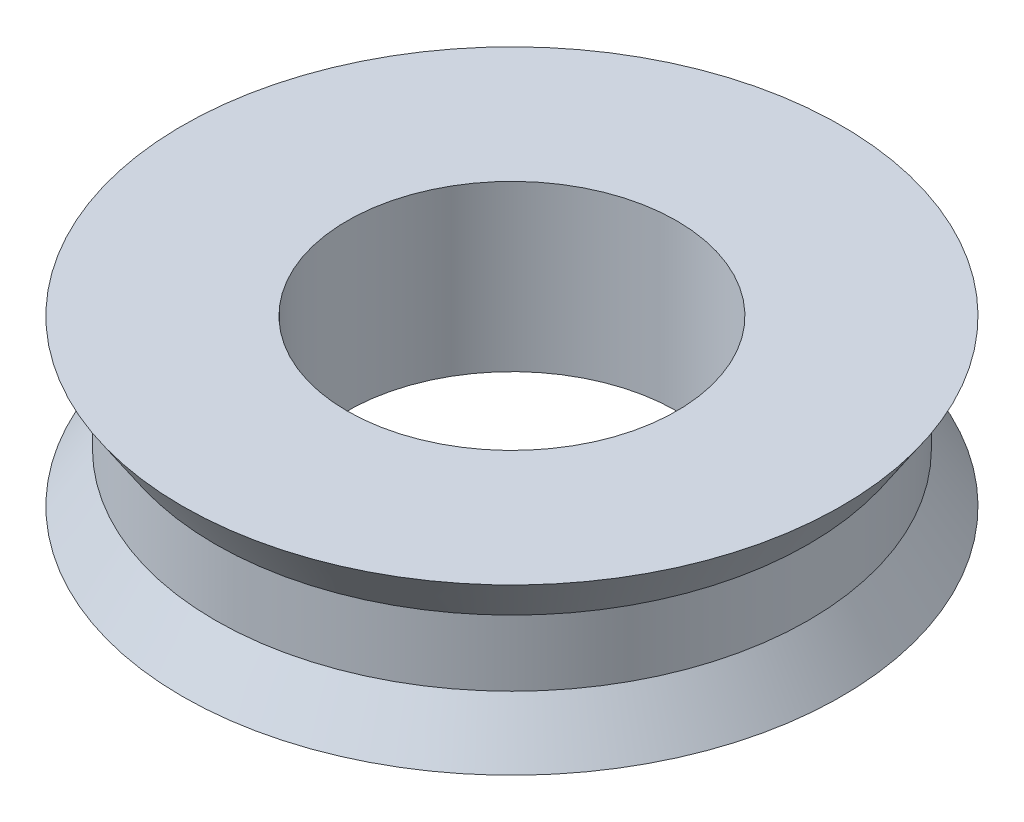
ISO-10303-21;
HEADER;
FILE_DESCRIPTION(('STEP AP214'),'2;1');
FILE_NAME('part.step','',(''),(''),'','','');
FILE_SCHEMA(('AUTOMOTIVE_DESIGN { 1 0 10303 214 1 1 1 1 }'));
ENDSEC;
DATA;
#1=APPLICATION_CONTEXT('core data for automotive mechanical design processes');
#2=APPLICATION_PROTOCOL_DEFINITION('international standard','automotive_design',2000,#1);
#3=PRODUCT_CONTEXT('',#1,'mechanical');
#4=PRODUCT('Part','Part','',(#3));
#5=PRODUCT_RELATED_PRODUCT_CATEGORY('part','',(#4));
#6=PRODUCT_DEFINITION_FORMATION('','',#4);
#7=PRODUCT_DEFINITION_CONTEXT('part definition',#1,'design');
#8=PRODUCT_DEFINITION('design','',#6,#7);
#9=PRODUCT_DEFINITION_SHAPE('','',#8);
#10=(LENGTH_UNIT() NAMED_UNIT(*) SI_UNIT(.MILLI.,.METRE.));
#11=(NAMED_UNIT(*) PLANE_ANGLE_UNIT() SI_UNIT($,.RADIAN.));
#12=(NAMED_UNIT(*) SI_UNIT($,.STERADIAN.) SOLID_ANGLE_UNIT());
#13=UNCERTAINTY_MEASURE_WITH_UNIT(LENGTH_MEASURE(1.E-05),#10,'distance_accuracy_value','');
#14=(GEOMETRIC_REPRESENTATION_CONTEXT(3) GLOBAL_UNCERTAINTY_ASSIGNED_CONTEXT((#13)) GLOBAL_UNIT_ASSIGNED_CONTEXT((#10,
#11,#12)) REPRESENTATION_CONTEXT('',''));
#15=CARTESIAN_POINT('',(0.,0.,0.));
#16=DIRECTION('',(0.,0.,1.));
#17=DIRECTION('',(1.,0.,0.));
#18=AXIS2_PLACEMENT_3D('',#15,#16,#17);
#19=CARTESIAN_POINT('',(0.,4.445,0.));
#20=DIRECTION('',(0.,1.,0.));
#21=DIRECTION('',(0.,0.,1.));
#22=AXIS2_PLACEMENT_3D('',#19,#20,#21);
#23=CONICAL_SURFACE('',#22,11.43,0.588002603547568);
#24=CARTESIAN_POINT('',(0.,6.35,0.));
#25=DIRECTION('',(0.,1.,0.));
#26=DIRECTION('',(0.,0.,1.));
#27=AXIS2_PLACEMENT_3D('',#24,#25,#26);
#28=CIRCLE('',#27,12.7);
#29=CARTESIAN_POINT('',(0.,6.35,12.7));
#30=VERTEX_POINT('',#29);
#31=EDGE_CURVE('E55',#30,#30,#28,.T.);
#32=ORIENTED_EDGE('',*,*,#31,.F.);
#33=EDGE_LOOP('',(#32));
#34=FACE_BOUND('',#33,.T.);
#35=CARTESIAN_POINT('',(0.,4.445,0.));
#36=DIRECTION('',(0.,1.,0.));
#37=DIRECTION('',(0.,0.,1.));
#38=AXIS2_PLACEMENT_3D('',#35,#36,#37);
#39=CIRCLE('',#38,11.43);
#40=CARTESIAN_POINT('',(0.,4.445,11.43));
#41=VERTEX_POINT('',#40);
#42=EDGE_CURVE('E10',#41,#41,#39,.T.);
#43=ORIENTED_EDGE('',*,*,#42,.T.);
#44=EDGE_LOOP('',(#43));
#45=FACE_BOUND('',#44,.T.);
#46=ADVANCED_FACE('F33',(#34,#45),#23,.T.);
#47=CARTESIAN_POINT('',(0.,6.35,0.));
#48=DIRECTION('',(0.,1.,0.));
#49=DIRECTION('',(0.,0.,1.));
#50=AXIS2_PLACEMENT_3D('',#47,#48,#49);
#51=CYLINDRICAL_SURFACE('',#50,11.43);
#52=ORIENTED_EDGE('',*,*,#42,.F.);
#53=EDGE_LOOP('',(#52));
#54=FACE_BOUND('',#53,.T.);
#55=CARTESIAN_POINT('',(0.,1.905,0.));
#56=DIRECTION('',(0.,1.,0.));
#57=DIRECTION('',(0.,0.,1.));
#58=AXIS2_PLACEMENT_3D('',#55,#56,#57);
#59=CIRCLE('',#58,11.43);
#60=CARTESIAN_POINT('',(0.,1.905,11.43));
#61=VERTEX_POINT('',#60);
#62=EDGE_CURVE('E39',#61,#61,#59,.T.);
#63=ORIENTED_EDGE('',*,*,#62,.T.);
#64=EDGE_LOOP('',(#63));
#65=FACE_BOUND('',#64,.T.);
#66=ADVANCED_FACE('F63',(#54,#65),#51,.T.);
#67=CARTESIAN_POINT('',(0.,1.905,0.));
#68=DIRECTION('',(0.,-1.,0.));
#69=DIRECTION('',(0.,0.,-1.));
#70=AXIS2_PLACEMENT_3D('',#67,#68,#69);
#71=CONICAL_SURFACE('',#70,11.43,0.588002603547568);
#72=CARTESIAN_POINT('',(0.,0.,0.));
#73=DIRECTION('',(0.,1.,0.));
#74=DIRECTION('',(0.,0.,1.));
#75=AXIS2_PLACEMENT_3D('',#72,#73,#74);
#76=CIRCLE('',#75,12.7);
#77=CARTESIAN_POINT('',(0.,0.,12.7));
#78=VERTEX_POINT('',#77);
#79=EDGE_CURVE('E43',#78,#78,#76,.T.);
#80=ORIENTED_EDGE('',*,*,#79,.T.);
#81=EDGE_LOOP('',(#80));
#82=FACE_BOUND('',#81,.T.);
#83=ORIENTED_EDGE('',*,*,#62,.F.);
#84=EDGE_LOOP('',(#83));
#85=FACE_BOUND('',#84,.T.);
#86=ADVANCED_FACE('F67',(#82,#85),#71,.T.);
#87=CARTESIAN_POINT('',(0.,0.,0.));
#88=DIRECTION('',(0.,-1.,0.));
#89=DIRECTION('',(0.,0.,-1.));
#90=AXIS2_PLACEMENT_3D('',#87,#88,#89);
#91=PLANE('',#90);
#92=CARTESIAN_POINT('',(0.,0.,0.));
#93=DIRECTION('',(0.,1.,0.));
#94=DIRECTION('',(0.,0.,1.));
#95=AXIS2_PLACEMENT_3D('',#92,#93,#94);
#96=CIRCLE('',#95,6.35);
#97=CARTESIAN_POINT('',(0.,0.,6.35));
#98=VERTEX_POINT('',#97);
#99=EDGE_CURVE('E47',#98,#98,#96,.T.);
#100=ORIENTED_EDGE('',*,*,#99,.T.);
#101=EDGE_LOOP('',(#100));
#102=FACE_BOUND('',#101,.T.);
#103=ORIENTED_EDGE('',*,*,#79,.F.);
#104=EDGE_LOOP('',(#103));
#105=FACE_BOUND('',#104,.T.);
#106=ADVANCED_FACE('F72',(#102,#105),#91,.T.);
#107=CARTESIAN_POINT('',(0.,6.35,0.));
#108=DIRECTION('',(0.,1.,0.));
#109=DIRECTION('',(0.,0.,1.));
#110=AXIS2_PLACEMENT_3D('',#107,#108,#109);
#111=CYLINDRICAL_SURFACE('',#110,6.35);
#112=CARTESIAN_POINT('',(0.,6.35,0.));
#113=DIRECTION('',(0.,1.,0.));
#114=DIRECTION('',(0.,0.,1.));
#115=AXIS2_PLACEMENT_3D('',#112,#113,#114);
#116=CIRCLE('',#115,6.35);
#117=CARTESIAN_POINT('',(0.,6.35,6.35));
#118=VERTEX_POINT('',#117);
#119=EDGE_CURVE('E52',#118,#118,#116,.T.);
#120=ORIENTED_EDGE('',*,*,#119,.T.);
#121=EDGE_LOOP('',(#120));
#122=FACE_BOUND('',#121,.T.);
#123=ORIENTED_EDGE('',*,*,#99,.F.);
#124=EDGE_LOOP('',(#123));
#125=FACE_BOUND('',#124,.T.);
#126=ADVANCED_FACE('F78',(#122,#125),#111,.F.);
#127=CARTESIAN_POINT('',(0.,6.35,0.));
#128=DIRECTION('',(0.,1.,0.));
#129=DIRECTION('',(0.,0.,1.));
#130=AXIS2_PLACEMENT_3D('',#127,#128,#129);
#131=PLANE('',#130);
#132=ORIENTED_EDGE('',*,*,#31,.T.);
#133=EDGE_LOOP('',(#132));
#134=FACE_BOUND('',#133,.T.);
#135=ORIENTED_EDGE('',*,*,#119,.F.);
#136=EDGE_LOOP('',(#135));
#137=FACE_BOUND('',#136,.T.);
#138=ADVANCED_FACE('F59',(#134,#137),#131,.T.);
#139=CLOSED_SHELL('',(#46,#66,#86,#106,#126,#138));
#140=MANIFOLD_SOLID_BREP('B2',#139);
#141=ADVANCED_BREP_SHAPE_REPRESENTATION('',(#18,#140),#14);
#142=SHAPE_DEFINITION_REPRESENTATION(#9,#141);
ENDSEC;
END-ISO-10303-21;
